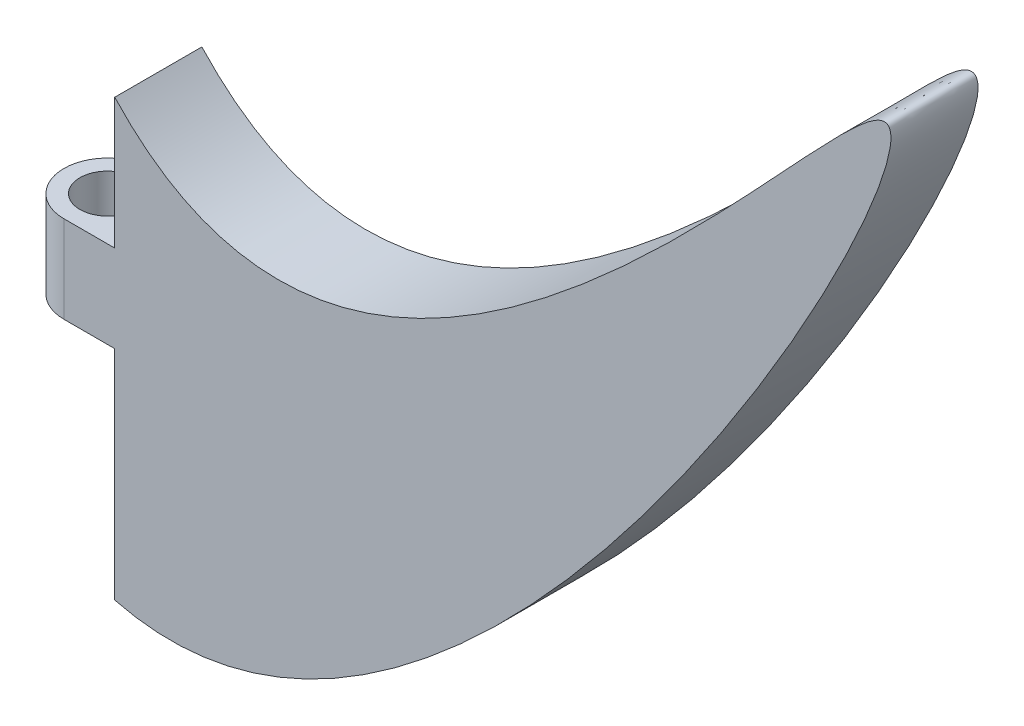
ISO-10303-21;
HEADER;
FILE_DESCRIPTION(('STEP AP214'),'2;1');
FILE_NAME('part.step','',(''),(''),'','','');
FILE_SCHEMA(('AUTOMOTIVE_DESIGN { 1 0 10303 214 1 1 1 1 }'));
ENDSEC;
DATA;
#1=APPLICATION_CONTEXT('core data for automotive mechanical design processes');
#2=APPLICATION_PROTOCOL_DEFINITION('international standard','automotive_design',2000,#1);
#3=PRODUCT_CONTEXT('',#1,'mechanical');
#4=PRODUCT('Part','Part','',(#3));
#5=PRODUCT_RELATED_PRODUCT_CATEGORY('part','',(#4));
#6=PRODUCT_DEFINITION_FORMATION('','',#4);
#7=PRODUCT_DEFINITION_CONTEXT('part definition',#1,'design');
#8=PRODUCT_DEFINITION('design','',#6,#7);
#9=PRODUCT_DEFINITION_SHAPE('','',#8);
#10=(LENGTH_UNIT() NAMED_UNIT(*) SI_UNIT(.MILLI.,.METRE.));
#11=(NAMED_UNIT(*) PLANE_ANGLE_UNIT() SI_UNIT($,.RADIAN.));
#12=(NAMED_UNIT(*) SI_UNIT($,.STERADIAN.) SOLID_ANGLE_UNIT());
#13=UNCERTAINTY_MEASURE_WITH_UNIT(LENGTH_MEASURE(1.E-05),#10,'distance_accuracy_value','');
#14=(GEOMETRIC_REPRESENTATION_CONTEXT(3) GLOBAL_UNCERTAINTY_ASSIGNED_CONTEXT((#13)) GLOBAL_UNIT_ASSIGNED_CONTEXT((#10,
#11,#12)) REPRESENTATION_CONTEXT('',''));
#15=CARTESIAN_POINT('',(0.,0.,0.));
#16=DIRECTION('',(0.,0.,1.));
#17=DIRECTION('',(1.,0.,0.));
#18=AXIS2_PLACEMENT_3D('',#15,#16,#17);
#19=CARTESIAN_POINT('',(0.,0.,6.));
#20=DIRECTION('',(1.,0.,0.));
#21=DIRECTION('',(0.,0.,-1.));
#22=AXIS2_PLACEMENT_3D('',#19,#20,#21);
#23=PLANE('',#22);
#24=DIRECTION('',(0.,0.,-1.));
#25=VECTOR('',#24,1.);
#26=CARTESIAN_POINT('',(0.,21.,0.));
#27=LINE('',#26,#25);
#28=CARTESIAN_POINT('',(0.,21.,6.));
#29=VERTEX_POINT('',#28);
#30=CARTESIAN_POINT('',(0.,21.,0.));
#31=VERTEX_POINT('',#30);
#32=EDGE_CURVE('E99',#29,#31,#27,.T.);
#33=ORIENTED_EDGE('',*,*,#32,.F.);
#34=DIRECTION('',(0.,-1.,0.));
#35=VECTOR('',#34,1.);
#36=CARTESIAN_POINT('',(0.,0.,6.));
#37=LINE('',#36,#35);
#38=CARTESIAN_POINT('',(0.,30.,6.));
#39=VERTEX_POINT('',#38);
#40=EDGE_CURVE('E158',#39,#29,#37,.T.);
#41=ORIENTED_EDGE('',*,*,#40,.F.);
#42=DIRECTION('',(0.,0.,-1.));
#43=VECTOR('',#42,1.);
#44=CARTESIAN_POINT('',(0.,30.,6.));
#45=LINE('',#44,#43);
#46=CARTESIAN_POINT('',(0.,30.,0.));
#47=VERTEX_POINT('',#46);
#48=EDGE_CURVE('E11',#39,#47,#45,.T.);
#49=ORIENTED_EDGE('',*,*,#48,.T.);
#50=DIRECTION('',(0.,-1.,0.));
#51=VECTOR('',#50,1.);
#52=CARTESIAN_POINT('',(0.,0.,0.));
#53=LINE('',#52,#51);
#54=EDGE_CURVE('E100',#47,#31,#53,.T.);
#55=ORIENTED_EDGE('',*,*,#54,.T.);
#56=EDGE_LOOP('',(#33,#41,#49,#55));
#57=FACE_BOUND('',#56,.T.);
#58=ADVANCED_FACE('F44',(#57),#23,.F.);
#59=CARTESIAN_POINT('',(0.,0.,6.));
#60=CARTESIAN_POINT('',(25.7273624046398,-6.61852046419522,6.));
#61=CARTESIAN_POINT('',(85.0032691043556,107.781526990717,6.));
#62=CARTESIAN_POINT('',(18.5263465212608,9.99484144962023,6.));
#63=CARTESIAN_POINT('',(0.,30.,6.));
#64=B_SPLINE_CURVE_WITH_KNOTS('',3,(#59,#60,#61,#62,#63),.UNSPECIFIED.,.F.,.F.,(4,1,4),(0.,
0.555968426810971,1.),.UNSPECIFIED.);
#65=DIRECTION('',(0.,0.,-1.));
#66=VECTOR('',#65,1.);
#67=SURFACE_OF_LINEAR_EXTRUSION('',#64,#66);
#68=CARTESIAN_POINT('',(0.,0.,0.));
#69=CARTESIAN_POINT('',(25.7273624046398,-6.61852046419522,0.));
#70=CARTESIAN_POINT('',(85.0032691043556,107.781526990717,0.));
#71=CARTESIAN_POINT('',(18.5263465212608,9.99484144962023,0.));
#72=CARTESIAN_POINT('',(0.,30.,0.));
#73=B_SPLINE_CURVE_WITH_KNOTS('',3,(#68,#69,#70,#71,#72),.UNSPECIFIED.,.F.,.F.,(4,1,4),(0.,
0.555968426810971,1.),.UNSPECIFIED.);
#74=CARTESIAN_POINT('',(0.,0.,0.));
#75=VERTEX_POINT('',#74);
#76=EDGE_CURVE('E151',#75,#47,#73,.T.);
#77=ORIENTED_EDGE('',*,*,#76,.T.);
#78=ORIENTED_EDGE('',*,*,#48,.F.);
#79=CARTESIAN_POINT('',(0.,0.,6.));
#80=VERTEX_POINT('',#79);
#81=EDGE_CURVE('E110',#80,#39,#64,.T.);
#82=ORIENTED_EDGE('',*,*,#81,.F.);
#83=DIRECTION('',(0.,0.,-1.));
#84=VECTOR('',#83,1.);
#85=CARTESIAN_POINT('',(0.,0.,6.));
#86=LINE('',#85,#84);
#87=EDGE_CURVE('E54',#80,#75,#86,.T.);
#88=ORIENTED_EDGE('',*,*,#87,.T.);
#89=EDGE_LOOP('',(#77,#78,#82,#88));
#90=FACE_BOUND('',#89,.T.);
#91=ADVANCED_FACE('F50',(#90),#67,.F.);
#92=CARTESIAN_POINT('',(0.,15.,6.));
#93=VERTEX_POINT('',#92);
#94=EDGE_CURVE('E69',#93,#80,#37,.T.);
#95=ORIENTED_EDGE('',*,*,#94,.F.);
#96=DIRECTION('',(0.,0.,-1.));
#97=VECTOR('',#96,1.);
#98=CARTESIAN_POINT('',(0.,15.,0.));
#99=LINE('',#98,#97);
#100=CARTESIAN_POINT('',(0.,15.,0.));
#101=VERTEX_POINT('',#100);
#102=EDGE_CURVE('E61',#93,#101,#99,.T.);
#103=ORIENTED_EDGE('',*,*,#102,.T.);
#104=EDGE_CURVE('E107',#101,#75,#53,.T.);
#105=ORIENTED_EDGE('',*,*,#104,.T.);
#106=ORIENTED_EDGE('',*,*,#87,.F.);
#107=EDGE_LOOP('',(#95,#103,#105,#106));
#108=FACE_BOUND('',#107,.T.);
#109=ADVANCED_FACE('F186',(#108),#23,.F.);
#110=CARTESIAN_POINT('',(53.4196892150743,53.743814134329,6.));
#111=DIRECTION('',(0.,0.,-1.));
#112=DIRECTION('',(-1.,0.,0.));
#113=AXIS2_PLACEMENT_3D('',#110,#111,#112);
#114=PLANE('',#113);
#115=ORIENTED_EDGE('',*,*,#81,.T.);
#116=ORIENTED_EDGE('',*,*,#40,.T.);
#117=DIRECTION('',(1.,0.,0.));
#118=VECTOR('',#117,1.);
#119=CARTESIAN_POINT('',(0.,21.,6.));
#120=LINE('',#119,#118);
#121=CARTESIAN_POINT('',(-3.5,21.,6.));
#122=VERTEX_POINT('',#121);
#123=EDGE_CURVE('E122',#122,#29,#120,.T.);
#124=ORIENTED_EDGE('',*,*,#123,.F.);
#125=DIRECTION('',(0.,-1.,0.));
#126=VECTOR('',#125,1.);
#127=CARTESIAN_POINT('',(-3.5,21.,6.));
#128=LINE('',#127,#126);
#129=CARTESIAN_POINT('',(-3.5,15.,6.));
#130=VERTEX_POINT('',#129);
#131=EDGE_CURVE('E137',#122,#130,#128,.T.);
#132=ORIENTED_EDGE('',*,*,#131,.T.);
#133=DIRECTION('',(1.,0.,0.));
#134=VECTOR('',#133,1.);
#135=CARTESIAN_POINT('',(0.,15.,6.));
#136=LINE('',#135,#134);
#137=EDGE_CURVE('E121',#130,#93,#136,.T.);
#138=ORIENTED_EDGE('',*,*,#137,.T.);
#139=ORIENTED_EDGE('',*,*,#94,.T.);
#140=EDGE_LOOP('',(#115,#116,#124,#132,#138,#139));
#141=FACE_BOUND('',#140,.T.);
#142=ADVANCED_FACE('F184',(#141),#114,.F.);
#143=CARTESIAN_POINT('',(53.4196892150743,53.743814134329,0.));
#144=DIRECTION('',(0.,0.,-1.));
#145=DIRECTION('',(-1.,0.,0.));
#146=AXIS2_PLACEMENT_3D('',#143,#144,#145);
#147=PLANE('',#146);
#148=ORIENTED_EDGE('',*,*,#76,.F.);
#149=ORIENTED_EDGE('',*,*,#104,.F.);
#150=DIRECTION('',(-1.,0.,0.));
#151=VECTOR('',#150,1.);
#152=CARTESIAN_POINT('',(0.,15.,0.));
#153=LINE('',#152,#151);
#154=CARTESIAN_POINT('',(-3.5,15.,0.));
#155=VERTEX_POINT('',#154);
#156=EDGE_CURVE('E143',#101,#155,#153,.T.);
#157=ORIENTED_EDGE('',*,*,#156,.T.);
#158=DIRECTION('',(0.,-1.,0.));
#159=VECTOR('',#158,1.);
#160=CARTESIAN_POINT('',(-3.5,21.,0.));
#161=LINE('',#160,#159);
#162=CARTESIAN_POINT('',(-3.5,21.,0.));
#163=VERTEX_POINT('',#162);
#164=EDGE_CURVE('E111',#163,#155,#161,.T.);
#165=ORIENTED_EDGE('',*,*,#164,.F.);
#166=DIRECTION('',(-1.,0.,0.));
#167=VECTOR('',#166,1.);
#168=CARTESIAN_POINT('',(0.,21.,0.));
#169=LINE('',#168,#167);
#170=EDGE_CURVE('E112',#31,#163,#169,.T.);
#171=ORIENTED_EDGE('',*,*,#170,.F.);
#172=ORIENTED_EDGE('',*,*,#54,.F.);
#173=EDGE_LOOP('',(#148,#149,#157,#165,#171,#172));
#174=FACE_BOUND('',#173,.T.);
#175=ADVANCED_FACE('F115',(#174),#147,.T.);
#176=CARTESIAN_POINT('',(-3.5,21.,3.));
#177=DIRECTION('',(0.,-1.,0.));
#178=DIRECTION('',(0.,0.,-1.));
#179=AXIS2_PLACEMENT_3D('',#176,#177,#178);
#180=CYLINDRICAL_SURFACE('',#179,3.);
#181=CARTESIAN_POINT('',(-3.5,15.,3.));
#182=DIRECTION('',(0.,1.,0.));
#183=DIRECTION('',(0.,0.,1.));
#184=AXIS2_PLACEMENT_3D('',#181,#182,#183);
#185=CIRCLE('',#184,3.);
#186=EDGE_CURVE('E126',#155,#130,#185,.T.);
#187=ORIENTED_EDGE('',*,*,#186,.T.);
#188=ORIENTED_EDGE('',*,*,#131,.F.);
#189=CARTESIAN_POINT('',(-3.5,21.,3.));
#190=DIRECTION('',(0.,1.,0.));
#191=DIRECTION('',(0.,0.,1.));
#192=AXIS2_PLACEMENT_3D('',#189,#190,#191);
#193=CIRCLE('',#192,3.);
#194=EDGE_CURVE('E120',#163,#122,#193,.T.);
#195=ORIENTED_EDGE('',*,*,#194,.F.);
#196=ORIENTED_EDGE('',*,*,#164,.T.);
#197=EDGE_LOOP('',(#187,#188,#195,#196));
#198=FACE_BOUND('',#197,.T.);
#199=ADVANCED_FACE('F185',(#198),#180,.T.);
#200=CARTESIAN_POINT('',(-3.5,21.,3.));
#201=DIRECTION('',(0.,1.,0.));
#202=DIRECTION('',(0.,0.,1.));
#203=AXIS2_PLACEMENT_3D('',#200,#201,#202);
#204=PLANE('',#203);
#205=CARTESIAN_POINT('',(-3.5,21.,3.));
#206=DIRECTION('',(0.,1.,0.));
#207=DIRECTION('',(0.,0.,1.));
#208=AXIS2_PLACEMENT_3D('',#205,#206,#207);
#209=CIRCLE('',#208,1.9);
#210=CARTESIAN_POINT('',(-3.5,21.,4.9));
#211=VERTEX_POINT('',#210);
#212=EDGE_CURVE('E134',#211,#211,#209,.T.);
#213=ORIENTED_EDGE('',*,*,#212,.F.);
#214=EDGE_LOOP('',(#213));
#215=FACE_BOUND('',#214,.T.);
#216=ORIENTED_EDGE('',*,*,#32,.T.);
#217=ORIENTED_EDGE('',*,*,#170,.T.);
#218=ORIENTED_EDGE('',*,*,#194,.T.);
#219=ORIENTED_EDGE('',*,*,#123,.T.);
#220=EDGE_LOOP('',(#216,#217,#218,#219));
#221=FACE_BOUND('',#220,.T.);
#222=ADVANCED_FACE('F123',(#215,#221),#204,.T.);
#223=CARTESIAN_POINT('',(-3.5,15.,3.));
#224=DIRECTION('',(0.,1.,0.));
#225=DIRECTION('',(0.,0.,1.));
#226=AXIS2_PLACEMENT_3D('',#223,#224,#225);
#227=PLANE('',#226);
#228=CARTESIAN_POINT('',(-3.5,15.,3.));
#229=DIRECTION('',(0.,1.,0.));
#230=DIRECTION('',(0.,0.,1.));
#231=AXIS2_PLACEMENT_3D('',#228,#229,#230);
#232=CIRCLE('',#231,1.9);
#233=CARTESIAN_POINT('',(-3.5,15.,4.9));
#234=VERTEX_POINT('',#233);
#235=EDGE_CURVE('E142',#234,#234,#232,.T.);
#236=ORIENTED_EDGE('',*,*,#235,.T.);
#237=EDGE_LOOP('',(#236));
#238=FACE_BOUND('',#237,.T.);
#239=ORIENTED_EDGE('',*,*,#102,.F.);
#240=ORIENTED_EDGE('',*,*,#137,.F.);
#241=ORIENTED_EDGE('',*,*,#186,.F.);
#242=ORIENTED_EDGE('',*,*,#156,.F.);
#243=EDGE_LOOP('',(#239,#240,#241,#242));
#244=FACE_BOUND('',#243,.T.);
#245=ADVANCED_FACE('F177',(#238,#244),#227,.F.);
#246=CARTESIAN_POINT('',(-3.5,15.,3.));
#247=DIRECTION('',(0.,1.,0.));
#248=DIRECTION('',(0.,0.,1.));
#249=AXIS2_PLACEMENT_3D('',#246,#247,#248);
#250=CYLINDRICAL_SURFACE('',#249,1.9);
#251=ORIENTED_EDGE('',*,*,#235,.F.);
#252=EDGE_LOOP('',(#251));
#253=FACE_BOUND('',#252,.T.);
#254=ORIENTED_EDGE('',*,*,#212,.T.);
#255=EDGE_LOOP('',(#254));
#256=FACE_BOUND('',#255,.T.);
#257=ADVANCED_FACE('F250',(#253,#256),#250,.F.);
#258=CLOSED_SHELL('',(#58,#91,#109,#142,#175,#199,#222,#245,#257));
#259=MANIFOLD_SOLID_BREP('B2',#258);
#260=ADVANCED_BREP_SHAPE_REPRESENTATION('',(#18,#259),#14);
#261=SHAPE_DEFINITION_REPRESENTATION(#9,#260);
ENDSEC;
END-ISO-10303-21;
